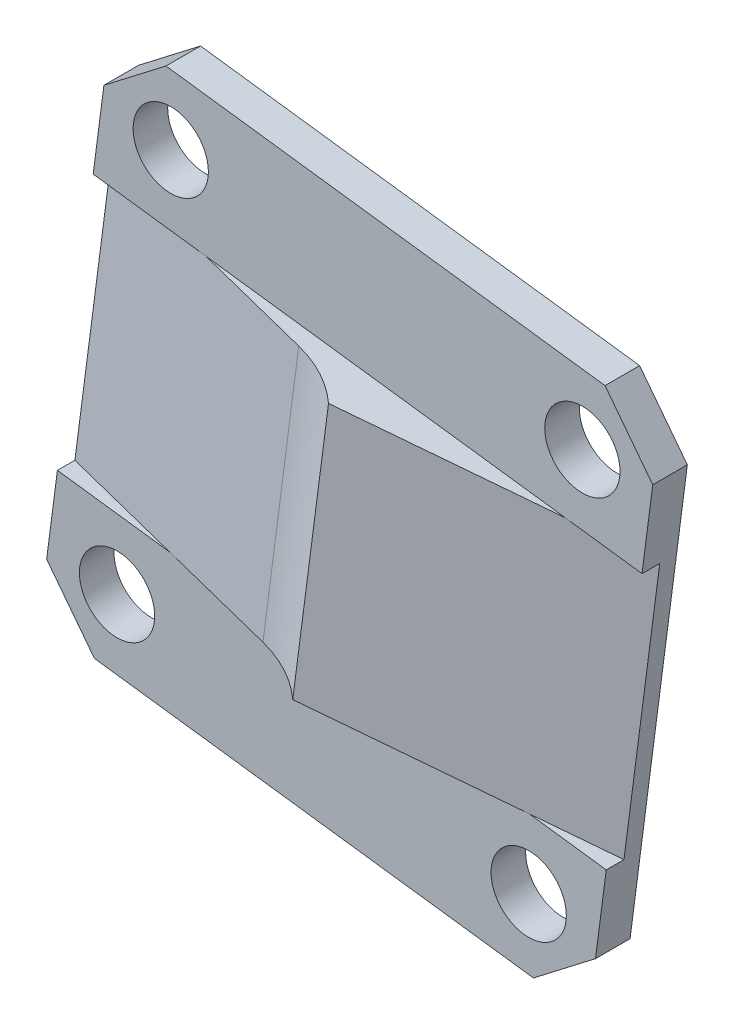
ISO-10303-21;
HEADER;
FILE_DESCRIPTION(('STEP AP214'),'2;1');
FILE_NAME('part.step','',(''),(''),'','','');
FILE_SCHEMA(('AUTOMOTIVE_DESIGN { 1 0 10303 214 1 1 1 1 }'));
ENDSEC;
DATA;
#1=APPLICATION_CONTEXT('core data for automotive mechanical design processes');
#2=APPLICATION_PROTOCOL_DEFINITION('international standard','automotive_design',2000,#1);
#3=PRODUCT_CONTEXT('',#1,'mechanical');
#4=PRODUCT('Part','Part','',(#3));
#5=PRODUCT_RELATED_PRODUCT_CATEGORY('part','',(#4));
#6=PRODUCT_DEFINITION_FORMATION('','',#4);
#7=PRODUCT_DEFINITION_CONTEXT('part definition',#1,'design');
#8=PRODUCT_DEFINITION('design','',#6,#7);
#9=PRODUCT_DEFINITION_SHAPE('','',#8);
#10=(LENGTH_UNIT() NAMED_UNIT(*) SI_UNIT(.MILLI.,.METRE.));
#11=(NAMED_UNIT(*) PLANE_ANGLE_UNIT() SI_UNIT($,.RADIAN.));
#12=(NAMED_UNIT(*) SI_UNIT($,.STERADIAN.) SOLID_ANGLE_UNIT());
#13=UNCERTAINTY_MEASURE_WITH_UNIT(LENGTH_MEASURE(1.E-05),#10,'distance_accuracy_value','');
#14=(GEOMETRIC_REPRESENTATION_CONTEXT(3) GLOBAL_UNCERTAINTY_ASSIGNED_CONTEXT((#13)) GLOBAL_UNIT_ASSIGNED_CONTEXT((#10,
#11,#12)) REPRESENTATION_CONTEXT('',''));
#15=CARTESIAN_POINT('',(0.,0.,0.));
#16=DIRECTION('',(0.,0.,1.));
#17=DIRECTION('',(1.,0.,0.));
#18=AXIS2_PLACEMENT_3D('',#15,#16,#17);
#19=CARTESIAN_POINT('',(-12.8749201201289,-95.3131633302013,-16.3901470670248));
#20=DIRECTION('',(0.129314816705219,0.991603589233367,0.));
#21=DIRECTION('',(-0.991603589233367,0.129314816705219,0.));
#22=AXIS2_PLACEMENT_3D('',#19,#20,#21);
#23=PLANE('',#22);
#24=CARTESIAN_POINT('',(-25.4682857033926,-93.670865158045,7.42404495764267));
#25=DIRECTION('',(0.129314816705216,0.991603589233367,0.));
#26=DIRECTION('',(-0.991603589233367,0.129314816705216,0.));
#27=AXIS2_PLACEMENT_3D('',#24,#25,#26);
#28=CIRCLE('',#27,5.11292162566616);
#29=CARTESIAN_POINT('',(-22.0751697641245,-94.1133606981078,3.62497540446073));
#30=VERTEX_POINT('',#29);
#31=CARTESIAN_POINT('',(-24.6967930672789,-93.7714753513841,2.37066546945623));
#32=VERTEX_POINT('',#31);
#33=EDGE_CURVE('E324',#30,#32,#28,.T.);
#34=ORIENTED_EDGE('',*,*,#33,.F.);
#35=DIRECTION('',(-0.966583129481826,0.126051903781364,0.223221798564149));
#36=VECTOR('',#35,1.);
#37=CARTESIAN_POINT('',(-22.4956389147935,-94.0585274040986,3.72207815454017));
#38=LINE('',#37,#36);
#39=CARTESIAN_POINT('',(-13.2526024102469,-95.2639098617289,1.5875));
#40=VERTEX_POINT('',#39);
#41=EDGE_CURVE('E319',#40,#30,#38,.T.);
#42=ORIENTED_EDGE('',*,*,#41,.F.);
#43=DIRECTION('',(0.991603589233367,-0.129314816705219,0.));
#44=VECTOR('',#43,1.);
#45=CARTESIAN_POINT('',(-12.8749201201289,-95.3131633302013,1.5875));
#46=LINE('',#45,#44);
#47=CARTESIAN_POINT('',(-29.7408483644544,-93.1136811549053,1.5875));
#48=VERTEX_POINT('',#47);
#49=EDGE_CURVE('E163',#48,#40,#46,.T.);
#50=ORIENTED_EDGE('',*,*,#49,.F.);
#51=DIRECTION('',(-0.980055945526266,0.127808890904245,-0.152168429854696));
#52=VECTOR('',#51,1.);
#53=CARTESIAN_POINT('',(-34.7935403491285,-92.454760649816,0.802993554876186));
#54=LINE('',#53,#52);
#55=EDGE_CURVE('E325',#32,#48,#54,.T.);
#56=ORIENTED_EDGE('',*,*,#55,.F.);
#57=EDGE_LOOP('',(#34,#42,#50,#56));
#58=FACE_BOUND('',#57,.T.);
#59=ADVANCED_FACE('F40',(#58),#23,.T.);
#60=CARTESIAN_POINT('',(-33.4072666671808,-105.443081655231,-16.3901470670248));
#61=DIRECTION('',(-0.129314816705217,-0.991603589233367,0.));
#62=DIRECTION('',(0.991603589233367,-0.129314816705217,0.));
#63=AXIS2_PLACEMENT_3D('',#60,#61,#62);
#64=PLANE('',#63);
#65=DIRECTION('',(-0.991603589233367,0.129314816705215,0.));
#66=VECTOR('',#65,1.);
#67=CARTESIAN_POINT('',(-14.5172182922851,-107.906528913465,1.5875));
#68=LINE('',#67,#66);
#69=CARTESIAN_POINT('',(-14.8949005824032,-107.857275444993,1.5875));
#70=VERTEX_POINT('',#69);
#71=CARTESIAN_POINT('',(-31.3831465366103,-105.707046738169,1.58750000000002));
#72=VERTEX_POINT('',#71);
#73=EDGE_CURVE('E295',#70,#72,#68,.T.);
#74=ORIENTED_EDGE('',*,*,#73,.F.);
#75=DIRECTION('',(0.966583129481826,-0.12605190378136,-0.22322179856415));
#76=VECTOR('',#75,1.);
#77=CARTESIAN_POINT('',(-24.13793708695,-106.651892987362,3.72207815454021));
#78=LINE('',#77,#76);
#79=CARTESIAN_POINT('',(-23.7174679362808,-106.706726281372,3.62497540446073));
#80=VERTEX_POINT('',#79);
#81=EDGE_CURVE('E313',#80,#70,#78,.T.);
#82=ORIENTED_EDGE('',*,*,#81,.F.);
#83=CARTESIAN_POINT('',(-27.1105838755489,-106.264230741309,7.42404495764267));
#84=DIRECTION('',(0.129314816705216,0.991603589233367,0.));
#85=DIRECTION('',(-0.991603589233367,0.129314816705216,0.));
#86=AXIS2_PLACEMENT_3D('',#83,#84,#85);
#87=CIRCLE('',#86,5.11292162566616);
#88=CARTESIAN_POINT('',(-26.3390912394352,-106.364840934648,2.37066546945623));
#89=VERTEX_POINT('',#88);
#90=EDGE_CURVE('E301',#89,#80,#87,.F.);
#91=ORIENTED_EDGE('',*,*,#90,.F.);
#92=DIRECTION('',(-0.980055945526266,0.127808890904247,-0.152168429854696));
#93=VECTOR('',#92,1.);
#94=CARTESIAN_POINT('',(-36.0414684643116,-105.099555949738,0.86422543926528));
#95=LINE('',#94,#93);
#96=EDGE_CURVE('E270',#89,#72,#95,.T.);
#97=ORIENTED_EDGE('',*,*,#96,.T.);
#98=EDGE_LOOP('',(#74,#82,#91,#97));
#99=FACE_BOUND('',#98,.T.);
#100=ADVANCED_FACE('F299',(#99),#64,.T.);
#101=CARTESIAN_POINT('',(-37.3767571490748,-111.329189903824,1.5875));
#102=DIRECTION('',(0.129314816705217,0.991603589233367,0.));
#103=DIRECTION('',(-0.991603589233367,0.129314816705217,0.));
#104=AXIS2_PLACEMENT_3D('',#101,#102,#103);
#105=PLANE('',#104);
#106=DIRECTION('',(0.991603589233367,-0.129314816705217,0.));
#107=VECTOR('',#106,1.);
#108=CARTESIAN_POINT('',(-37.3767571490748,-111.329189903824,0.));
#109=LINE('',#108,#107);
#110=CARTESIAN_POINT('',(-34.8580840324221,-111.657649538255,0.));
#111=VERTEX_POINT('',#110);
#112=CARTESIAN_POINT('',(-14.7086990992001,-114.285326613705,0.));
#113=VERTEX_POINT('',#112);
#114=EDGE_CURVE('E214',#111,#113,#109,.T.);
#115=ORIENTED_EDGE('',*,*,#114,.T.);
#116=DIRECTION('',(0.,0.,1.));
#117=VECTOR('',#116,1.);
#118=CARTESIAN_POINT('',(-14.7086990992001,-114.285326613705,1.5875));
#119=LINE('',#118,#117);
#120=CARTESIAN_POINT('',(-14.7086990992001,-114.285326613705,1.5875));
#121=VERTEX_POINT('',#120);
#122=EDGE_CURVE('E256',#113,#121,#119,.T.);
#123=ORIENTED_EDGE('',*,*,#122,.T.);
#124=DIRECTION('',(0.991603589233367,-0.129314816705217,0.));
#125=VECTOR('',#124,1.);
#126=CARTESIAN_POINT('',(-37.3767571490748,-111.329189903824,1.5875));
#127=LINE('',#126,#125);
#128=CARTESIAN_POINT('',(-34.8580840324221,-111.657649538255,1.5875));
#129=VERTEX_POINT('',#128);
#130=EDGE_CURVE('E199',#129,#121,#127,.T.);
#131=ORIENTED_EDGE('',*,*,#130,.F.);
#132=DIRECTION('',(0.,0.,-1.));
#133=VECTOR('',#132,1.);
#134=CARTESIAN_POINT('',(-34.8580840324221,-111.657649538255,1.5875));
#135=LINE('',#134,#133);
#136=EDGE_CURVE('E253',#129,#111,#135,.T.);
#137=ORIENTED_EDGE('',*,*,#136,.T.);
#138=EDGE_LOOP('',(#115,#123,#131,#137));
#139=FACE_BOUND('',#138,.T.);
#140=ADVANCED_FACE('F342',(#139),#105,.F.);
#141=CARTESIAN_POINT('',(-34.0921608047624,-86.142458737296,1.5875));
#142=DIRECTION('',(-0.129314816705216,-0.991603589233367,0.));
#143=DIRECTION('',(0.991603589233367,-0.129314816705216,0.));
#144=AXIS2_PLACEMENT_3D('',#141,#142,#143);
#145=PLANE('',#144);
#146=DIRECTION('',(-0.991603589233367,0.129314816705216,0.));
#147=VECTOR('',#146,1.);
#148=CARTESIAN_POINT('',(-34.0921608047624,-86.142458737296,1.5875));
#149=LINE('',#148,#147);
#150=CARTESIAN_POINT('',(-11.4241027548876,-89.0985954471772,1.5875));
#151=VERTEX_POINT('',#150);
#152=CARTESIAN_POINT('',(-31.5734876881096,-86.4709183717272,1.5875));
#153=VERTEX_POINT('',#152);
#154=EDGE_CURVE('E186',#151,#153,#149,.T.);
#155=ORIENTED_EDGE('',*,*,#154,.F.);
#156=DIRECTION('',(0.,0.,-1.));
#157=VECTOR('',#156,1.);
#158=CARTESIAN_POINT('',(-11.4241027548876,-89.0985954471772,1.5875));
#159=LINE('',#158,#157);
#160=CARTESIAN_POINT('',(-11.4241027548876,-89.0985954471772,0.));
#161=VERTEX_POINT('',#160);
#162=EDGE_CURVE('E236',#151,#161,#159,.T.);
#163=ORIENTED_EDGE('',*,*,#162,.T.);
#164=DIRECTION('',(-0.991603589233367,0.129314816705216,0.));
#165=VECTOR('',#164,1.);
#166=CARTESIAN_POINT('',(-34.0921608047624,-86.142458737296,0.));
#167=LINE('',#166,#165);
#168=CARTESIAN_POINT('',(-31.5734876881096,-86.4709183717272,0.));
#169=VERTEX_POINT('',#168);
#170=EDGE_CURVE('E226',#161,#169,#167,.T.);
#171=ORIENTED_EDGE('',*,*,#170,.T.);
#172=DIRECTION('',(0.,0.,1.));
#173=VECTOR('',#172,1.);
#174=CARTESIAN_POINT('',(-31.5734876881096,-86.4709183717272,1.5875));
#175=LINE('',#174,#173);
#176=EDGE_CURVE('E221',#169,#153,#175,.T.);
#177=ORIENTED_EDGE('',*,*,#176,.T.);
#178=EDGE_LOOP('',(#155,#163,#171,#177));
#179=FACE_BOUND('',#178,.T.);
#180=ADVANCED_FACE('F353',(#179),#145,.F.);
#181=CARTESIAN_POINT('',(-14.9277928353242,-111.054870309281,0.));
#182=DIRECTION('',(0.,0.,-1.));
#183=DIRECTION('',(-1.,0.,0.));
#184=AXIS2_PLACEMENT_3D('',#181,#182,#183);
#185=CYLINDRICAL_SURFACE('',#184,1.72719999999999);
#186=CARTESIAN_POINT('',(-14.9277928353242,-111.054870309281,0.));
#187=DIRECTION('',(0.,0.,-1.));
#188=DIRECTION('',(-1.,0.,0.));
#189=AXIS2_PLACEMENT_3D('',#186,#187,#188);
#190=CIRCLE('',#189,1.72719999999999);
#191=CARTESIAN_POINT('',(-16.6549928353242,-111.054870309281,0.));
#192=VERTEX_POINT('',#191);
#193=EDGE_CURVE('E211',#192,#192,#190,.T.);
#194=ORIENTED_EDGE('',*,*,#193,.T.);
#195=EDGE_LOOP('',(#194));
#196=FACE_BOUND('',#195,.T.);
#197=CARTESIAN_POINT('',(-14.9277928353242,-111.054870309281,1.5875));
#198=DIRECTION('',(0.,0.,1.));
#199=DIRECTION('',(1.,0.,0.));
#200=AXIS2_PLACEMENT_3D('',#197,#198,#199);
#201=CIRCLE('',#200,1.72719999999999);
#202=CARTESIAN_POINT('',(-13.2005928353242,-111.054870309281,1.5875));
#203=VERTEX_POINT('',#202);
#204=EDGE_CURVE('E198',#203,#203,#201,.F.);
#205=ORIENTED_EDGE('',*,*,#204,.F.);
#206=EDGE_LOOP('',(#205));
#207=FACE_BOUND('',#206,.T.);
#208=ADVANCED_FACE('F355',(#196,#207),#185,.F.);
#209=CARTESIAN_POINT('',(-33.8178412102199,-108.591423051047,0.));
#210=DIRECTION('',(0.,0.,-1.));
#211=DIRECTION('',(-1.,0.,0.));
#212=AXIS2_PLACEMENT_3D('',#209,#210,#211);
#213=CYLINDRICAL_SURFACE('',#212,1.72719999999999);
#214=CARTESIAN_POINT('',(-33.8178412102199,-108.591423051047,0.));
#215=DIRECTION('',(0.,0.,-1.));
#216=DIRECTION('',(-1.,0.,0.));
#217=AXIS2_PLACEMENT_3D('',#214,#215,#216);
#218=CIRCLE('',#217,1.72719999999998);
#219=CARTESIAN_POINT('',(-35.5450412102198,-108.591423051047,0.));
#220=VERTEX_POINT('',#219);
#221=EDGE_CURVE('E208',#220,#220,#218,.T.);
#222=ORIENTED_EDGE('',*,*,#221,.T.);
#223=EDGE_LOOP('',(#222));
#224=FACE_BOUND('',#223,.T.);
#225=CARTESIAN_POINT('',(-33.8178412102199,-108.591423051047,1.5875));
#226=DIRECTION('',(0.,0.,1.));
#227=DIRECTION('',(1.,0.,0.));
#228=AXIS2_PLACEMENT_3D('',#225,#226,#227);
#229=CIRCLE('',#228,1.72719999999999);
#230=CARTESIAN_POINT('',(-32.0906412102199,-108.591423051047,1.5875));
#231=VERTEX_POINT('',#230);
#232=EDGE_CURVE('E194',#231,#231,#229,.F.);
#233=ORIENTED_EDGE('',*,*,#232,.F.);
#234=EDGE_LOOP('',(#233));
#235=FACE_BOUND('',#234,.T.);
#236=ADVANCED_FACE('F361',(#224,#235),#213,.F.);
#237=CARTESIAN_POINT('',(-31.3543939519855,-89.701374676151,0.));
#238=DIRECTION('',(0.,0.,-1.));
#239=DIRECTION('',(-1.,0.,0.));
#240=AXIS2_PLACEMENT_3D('',#237,#238,#239);
#241=CYLINDRICAL_SURFACE('',#240,1.72719999999999);
#242=CARTESIAN_POINT('',(-31.3543939519855,-89.701374676151,0.));
#243=DIRECTION('',(0.,0.,-1.));
#244=DIRECTION('',(-1.,0.,0.));
#245=AXIS2_PLACEMENT_3D('',#242,#243,#244);
#246=CIRCLE('',#245,1.72719999999999);
#247=CARTESIAN_POINT('',(-33.0815939519855,-89.701374676151,0.));
#248=VERTEX_POINT('',#247);
#249=EDGE_CURVE('E205',#248,#248,#246,.T.);
#250=ORIENTED_EDGE('',*,*,#249,.T.);
#251=EDGE_LOOP('',(#250));
#252=FACE_BOUND('',#251,.T.);
#253=CARTESIAN_POINT('',(-31.3543939519855,-89.701374676151,1.5875));
#254=DIRECTION('',(0.,0.,1.));
#255=DIRECTION('',(1.,0.,0.));
#256=AXIS2_PLACEMENT_3D('',#253,#254,#255);
#257=CIRCLE('',#256,1.72719999999999);
#258=CARTESIAN_POINT('',(-29.6271939519855,-89.701374676151,1.5875));
#259=VERTEX_POINT('',#258);
#260=EDGE_CURVE('E182',#259,#259,#257,.F.);
#261=ORIENTED_EDGE('',*,*,#260,.F.);
#262=EDGE_LOOP('',(#261));
#263=FACE_BOUND('',#262,.T.);
#264=ADVANCED_FACE('F383',(#252,#263),#241,.F.);
#265=CARTESIAN_POINT('',(-12.4643455770898,-92.1648219343853,0.));
#266=DIRECTION('',(0.,0.,-1.));
#267=DIRECTION('',(-1.,0.,0.));
#268=AXIS2_PLACEMENT_3D('',#265,#266,#267);
#269=CYLINDRICAL_SURFACE('',#268,1.72719999999999);
#270=CARTESIAN_POINT('',(-12.4643455770898,-92.1648219343853,0.));
#271=DIRECTION('',(0.,0.,-1.));
#272=DIRECTION('',(-1.,0.,0.));
#273=AXIS2_PLACEMENT_3D('',#270,#271,#272);
#274=CIRCLE('',#273,1.72719999999999);
#275=CARTESIAN_POINT('',(-14.1915455770898,-92.1648219343853,0.));
#276=VERTEX_POINT('',#275);
#277=EDGE_CURVE('E202',#276,#276,#274,.T.);
#278=ORIENTED_EDGE('',*,*,#277,.T.);
#279=EDGE_LOOP('',(#278));
#280=FACE_BOUND('',#279,.T.);
#281=CARTESIAN_POINT('',(-12.4643455770898,-92.1648219343853,1.5875));
#282=DIRECTION('',(0.,0.,1.));
#283=DIRECTION('',(1.,0.,0.));
#284=AXIS2_PLACEMENT_3D('',#281,#282,#283);
#285=CIRCLE('',#284,1.72719999999999);
#286=CARTESIAN_POINT('',(-10.7371455770898,-92.1648219343853,1.5875));
#287=VERTEX_POINT('',#286);
#288=EDGE_CURVE('E183',#287,#287,#285,.F.);
#289=ORIENTED_EDGE('',*,*,#288,.F.);
#290=EDGE_LOOP('',(#289));
#291=FACE_BOUND('',#290,.T.);
#292=ADVANCED_FACE('F380',(#280,#291),#269,.F.);
#293=CARTESIAN_POINT('',(-12.1900259825473,-114.613786248136,1.5875));
#294=DIRECTION('',(-0.991603589233367,0.129314816705216,0.));
#295=DIRECTION('',(-0.129314816705216,-0.991603589233367,0.));
#296=AXIS2_PLACEMENT_3D('',#293,#294,#295);
#297=PLANE('',#296);
#298=DIRECTION('',(-0.129314816705216,-0.991603589233367,0.));
#299=VECTOR('',#298,1.);
#300=CARTESIAN_POINT('',(-12.1900259825473,-114.613786248136,0.773203407242427));
#301=LINE('',#300,#299);
#302=CARTESIAN_POINT('',(-9.72657872431296,-95.7237378732403,0.773203407242454));
#303=VERTEX_POINT('',#302);
#304=CARTESIAN_POINT('',(-11.3688768964692,-108.317103456504,0.773203407242436));
#305=VERTEX_POINT('',#304);
#306=EDGE_CURVE('E287',#303,#305,#301,.T.);
#307=ORIENTED_EDGE('',*,*,#306,.T.);
#308=DIRECTION('',(0.,1.43045566281054E-13,1.));
#309=VECTOR('',#308,1.);
#310=CARTESIAN_POINT('',(-11.3688768964692,-108.317103456504,1.58749999999908));
#311=LINE('',#310,#309);
#312=CARTESIAN_POINT('',(-11.3688768964691,-108.317103456504,1.5875));
#313=VERTEX_POINT('',#312);
#314=EDGE_CURVE('E176',#305,#313,#311,.T.);
#315=ORIENTED_EDGE('',*,*,#314,.T.);
#316=DIRECTION('',(0.129314816705216,0.991603589233367,0.));
#317=VECTOR('',#316,1.);
#318=CARTESIAN_POINT('',(-12.1900259825473,-114.613786248136,1.5875));
#319=LINE('',#318,#317);
#320=CARTESIAN_POINT('',(-11.8615663481161,-112.095113131483,1.5875));
#321=VERTEX_POINT('',#320);
#322=EDGE_CURVE('E215',#321,#313,#319,.T.);
#323=ORIENTED_EDGE('',*,*,#322,.F.);
#324=DIRECTION('',(0.,0.,-1.));
#325=VECTOR('',#324,1.);
#326=CARTESIAN_POINT('',(-11.8615663481161,-112.095113131483,1.5875));
#327=LINE('',#326,#325);
#328=CARTESIAN_POINT('',(-11.8615663481161,-112.095113131483,0.));
#329=VERTEX_POINT('',#328);
#330=EDGE_CURVE('E247',#321,#329,#327,.T.);
#331=ORIENTED_EDGE('',*,*,#330,.T.);
#332=DIRECTION('',(0.129314816705216,0.991603589233367,0.));
#333=VECTOR('',#332,1.);
#334=CARTESIAN_POINT('',(-12.1900259825473,-114.613786248136,0.));
#335=LINE('',#334,#333);
#336=CARTESIAN_POINT('',(-9.23388927266609,-91.9457281982612,0.));
#337=VERTEX_POINT('',#336);
#338=EDGE_CURVE('E224',#329,#337,#335,.T.);
#339=ORIENTED_EDGE('',*,*,#338,.T.);
#340=DIRECTION('',(0.,0.,1.));
#341=VECTOR('',#340,1.);
#342=CARTESIAN_POINT('',(-9.23388927266609,-91.9457281982612,1.5875));
#343=LINE('',#342,#341);
#344=CARTESIAN_POINT('',(-9.23388927266603,-91.9457281982612,1.5875));
#345=VERTEX_POINT('',#344);
#346=EDGE_CURVE('E181',#337,#345,#343,.T.);
#347=ORIENTED_EDGE('',*,*,#346,.T.);
#348=DIRECTION('',(-0.129314816705216,-0.991603589233367,0.));
#349=VECTOR('',#348,1.);
#350=CARTESIAN_POINT('',(-15.4960831563037,-139.965081971508,1.5875));
#351=LINE('',#350,#349);
#352=CARTESIAN_POINT('',(-9.7265787243129,-95.7237378732403,1.5875));
#353=VERTEX_POINT('',#352);
#354=EDGE_CURVE('E159',#345,#353,#351,.T.);
#355=ORIENTED_EDGE('',*,*,#354,.T.);
#356=DIRECTION('',(0.,0.,-1.));
#357=VECTOR('',#356,1.);
#358=CARTESIAN_POINT('',(-9.72657872431296,-95.7237378732403,1.58750000000025));
#359=LINE('',#358,#357);
#360=EDGE_CURVE('E170',#353,#303,#359,.T.);
#361=ORIENTED_EDGE('',*,*,#360,.T.);
#362=EDGE_LOOP('',(#307,#315,#323,#331,#339,#347,#355,#361));
#363=FACE_BOUND('',#362,.T.);
#364=ADVANCED_FACE('F178',(#363),#297,.F.);
#365=CARTESIAN_POINT('',(-37.3767571490748,-111.329189903824,1.5875));
#366=DIRECTION('',(0.991603589233367,-0.129314816705216,0.));
#367=DIRECTION('',(0.129314816705216,0.991603589233367,0.));
#368=AXIS2_PLACEMENT_3D('',#365,#366,#367);
#369=PLANE('',#368);
#370=DIRECTION('',(-0.129314816705216,-0.991603589233367,0.));
#371=VECTOR('',#370,1.);
#372=CARTESIAN_POINT('',(-37.3767571490748,-111.329189903824,0.));
#373=LINE('',#372,#371);
#374=CARTESIAN_POINT('',(-34.4206204391936,-88.6611318539487,0.));
#375=VERTEX_POINT('',#374);
#376=CARTESIAN_POINT('',(-37.0482975146436,-108.810516787171,0.));
#377=VERTEX_POINT('',#376);
#378=EDGE_CURVE('E219',#375,#377,#373,.T.);
#379=ORIENTED_EDGE('',*,*,#378,.T.);
#380=DIRECTION('',(0.,0.,1.));
#381=VECTOR('',#380,1.);
#382=CARTESIAN_POINT('',(-37.0482975146436,-108.810516787171,1.5875));
#383=LINE('',#382,#381);
#384=CARTESIAN_POINT('',(-37.0482975146436,-108.810516787171,1.5875));
#385=VERTEX_POINT('',#384);
#386=EDGE_CURVE('E263',#377,#385,#383,.T.);
#387=ORIENTED_EDGE('',*,*,#386,.T.);
#388=DIRECTION('',(0.129314816705216,0.991603589233367,0.));
#389=VECTOR('',#388,1.);
#390=CARTESIAN_POINT('',(-40.6828143228312,-136.680485627195,1.5875));
#391=LINE('',#390,#389);
#392=CARTESIAN_POINT('',(-36.5556080629967,-105.032507112192,1.5875));
#393=VERTEX_POINT('',#392);
#394=EDGE_CURVE('E195',#385,#393,#391,.T.);
#395=ORIENTED_EDGE('',*,*,#394,.T.);
#396=DIRECTION('',(0.,0.,-1.));
#397=VECTOR('',#396,1.);
#398=CARTESIAN_POINT('',(-36.5556080629967,-105.032507112192,6.23249877893638));
#399=LINE('',#398,#397);
#400=CARTESIAN_POINT('',(-36.5556080629967,-105.032507112192,0.784397531669635));
#401=VERTEX_POINT('',#400);
#402=EDGE_CURVE('E273',#393,#401,#399,.T.);
#403=ORIENTED_EDGE('',*,*,#402,.T.);
#404=DIRECTION('',(0.129314816705216,0.991603589233367,0.));
#405=VECTOR('',#404,1.);
#406=CARTESIAN_POINT('',(-40.6828143228312,-136.680485627195,0.78439753166964));
#407=LINE('',#406,#405);
#408=CARTESIAN_POINT('',(-34.9133098908405,-92.4391415289277,0.784397531669635));
#409=VERTEX_POINT('',#408);
#410=EDGE_CURVE('E12',#401,#409,#407,.T.);
#411=ORIENTED_EDGE('',*,*,#410,.T.);
#412=DIRECTION('',(0.,0.,-1.));
#413=VECTOR('',#412,1.);
#414=CARTESIAN_POINT('',(-34.9133098908405,-92.4391415289277,1.58750000000001));
#415=LINE('',#414,#413);
#416=CARTESIAN_POINT('',(-34.9133098908405,-92.4391415289278,1.5875));
#417=VERTEX_POINT('',#416);
#418=EDGE_CURVE('E48',#417,#409,#415,.T.);
#419=ORIENTED_EDGE('',*,*,#418,.F.);
#420=DIRECTION('',(-0.129314816705216,-0.991603589233367,0.));
#421=VECTOR('',#420,1.);
#422=CARTESIAN_POINT('',(-37.3767571490748,-111.329189903824,1.5875));
#423=LINE('',#422,#421);
#424=CARTESIAN_POINT('',(-34.4206204391936,-88.6611318539487,1.5875));
#425=VERTEX_POINT('',#424);
#426=EDGE_CURVE('E218',#425,#417,#423,.T.);
#427=ORIENTED_EDGE('',*,*,#426,.F.);
#428=DIRECTION('',(0.,0.,-1.));
#429=VECTOR('',#428,1.);
#430=CARTESIAN_POINT('',(-34.4206204391936,-88.6611318539487,1.5875));
#431=LINE('',#430,#429);
#432=EDGE_CURVE('E260',#425,#375,#431,.T.);
#433=ORIENTED_EDGE('',*,*,#432,.T.);
#434=EDGE_LOOP('',(#379,#387,#395,#403,#411,#419,#427,#433));
#435=FACE_BOUND('',#434,.T.);
#436=ADVANCED_FACE('F281',(#435),#369,.F.);
#437=CARTESIAN_POINT('',(0.,0.,0.));
#438=DIRECTION('',(0.,0.,1.));
#439=DIRECTION('',(1.,0.,0.));
#440=AXIS2_PLACEMENT_3D('',#437,#438,#439);
#441=PLANE('',#440);
#442=ORIENTED_EDGE('',*,*,#277,.F.);
#443=EDGE_LOOP('',(#442));
#444=FACE_BOUND('',#443,.T.);
#445=ORIENTED_EDGE('',*,*,#249,.F.);
#446=EDGE_LOOP('',(#445));
#447=FACE_BOUND('',#446,.T.);
#448=ORIENTED_EDGE('',*,*,#221,.F.);
#449=EDGE_LOOP('',(#448));
#450=FACE_BOUND('',#449,.T.);
#451=ORIENTED_EDGE('',*,*,#193,.F.);
#452=EDGE_LOOP('',(#451));
#453=FACE_BOUND('',#452,.T.);
#454=ORIENTED_EDGE('',*,*,#170,.F.);
#455=DIRECTION('',(-0.609730238395681,0.792609005995987,0.));
#456=VECTOR('',#455,1.);
#457=CARTESIAN_POINT('',(-11.4241027548876,-89.0985954471772,0.));
#458=LINE('',#457,#456);
#459=EDGE_CURVE('E245',#161,#337,#458,.F.);
#460=ORIENTED_EDGE('',*,*,#459,.T.);
#461=ORIENTED_EDGE('',*,*,#338,.F.);
#462=DIRECTION('',(0.792609005995989,0.609730238395679,0.));
#463=VECTOR('',#462,1.);
#464=CARTESIAN_POINT('',(-11.8615663481161,-112.095113131483,0.));
#465=LINE('',#464,#463);
#466=EDGE_CURVE('E243',#329,#113,#465,.F.);
#467=ORIENTED_EDGE('',*,*,#466,.T.);
#468=ORIENTED_EDGE('',*,*,#114,.F.);
#469=DIRECTION('',(0.60973023839568,-0.792609005995987,0.));
#470=VECTOR('',#469,1.);
#471=CARTESIAN_POINT('',(-34.8580840324221,-111.657649538255,0.));
#472=LINE('',#471,#470);
#473=EDGE_CURVE('E241',#111,#377,#472,.F.);
#474=ORIENTED_EDGE('',*,*,#473,.T.);
#475=ORIENTED_EDGE('',*,*,#378,.F.);
#476=DIRECTION('',(-0.79260900599599,-0.609730238395677,0.));
#477=VECTOR('',#476,1.);
#478=CARTESIAN_POINT('',(-34.4206204391936,-88.6611318539487,0.));
#479=LINE('',#478,#477);
#480=EDGE_CURVE('E239',#375,#169,#479,.F.);
#481=ORIENTED_EDGE('',*,*,#480,.T.);
#482=EDGE_LOOP('',(#454,#460,#461,#467,#468,#474,#475,#481));
#483=FACE_BOUND('',#482,.T.);
#484=ADVANCED_FACE('F335',(#444,#447,#450,#453,#483),#441,.F.);
#485=CARTESIAN_POINT('',(0.,0.,1.5875));
#486=DIRECTION('',(0.,0.,1.));
#487=DIRECTION('',(1.,0.,0.));
#488=AXIS2_PLACEMENT_3D('',#485,#486,#487);
#489=PLANE('',#488);
#490=ORIENTED_EDGE('',*,*,#426,.T.);
#491=EDGE_CURVE('E168',#417,#48,#46,.T.);
#492=ORIENTED_EDGE('',*,*,#491,.T.);
#493=ORIENTED_EDGE('',*,*,#49,.T.);
#494=EDGE_CURVE('E152',#40,#353,#46,.T.);
#495=ORIENTED_EDGE('',*,*,#494,.T.);
#496=ORIENTED_EDGE('',*,*,#354,.F.);
#497=DIRECTION('',(0.609730238395681,-0.792609005995987,0.));
#498=VECTOR('',#497,1.);
#499=CARTESIAN_POINT('',(-50.2363154021322,-38.6452845407333,1.5875));
#500=LINE('',#499,#498);
#501=EDGE_CURVE('E251',#345,#151,#500,.F.);
#502=ORIENTED_EDGE('',*,*,#501,.T.);
#503=ORIENTED_EDGE('',*,*,#154,.T.);
#504=DIRECTION('',(0.79260900599599,0.609730238395677,0.));
#505=VECTOR('',#504,1.);
#506=CARTESIAN_POINT('',(30.0513587183587,-39.0647799021084,1.5875));
#507=LINE('',#506,#505);
#508=EDGE_CURVE('E268',#153,#425,#507,.F.);
#509=ORIENTED_EDGE('',*,*,#508,.T.);
#510=EDGE_LOOP('',(#490,#492,#493,#495,#496,#502,#503,#509));
#511=FACE_BOUND('',#510,.T.);
#512=ORIENTED_EDGE('',*,*,#288,.T.);
#513=EDGE_LOOP('',(#512));
#514=FACE_BOUND('',#513,.T.);
#515=ORIENTED_EDGE('',*,*,#260,.T.);
#516=EDGE_LOOP('',(#515));
#517=FACE_BOUND('',#516,.T.);
#518=ADVANCED_FACE('F155',(#511,#514,#517),#489,.T.);
#519=CARTESIAN_POINT('',(0.,0.,1.5875));
#520=DIRECTION('',(0.,0.,1.));
#521=DIRECTION('',(1.,0.,0.));
#522=AXIS2_PLACEMENT_3D('',#519,#520,#521);
#523=PLANE('',#522);
#524=EDGE_CURVE('E166',#313,#70,#68,.T.);
#525=ORIENTED_EDGE('',*,*,#524,.T.);
#526=ORIENTED_EDGE('',*,*,#73,.T.);
#527=EDGE_CURVE('E290',#72,#393,#68,.T.);
#528=ORIENTED_EDGE('',*,*,#527,.T.);
#529=ORIENTED_EDGE('',*,*,#394,.F.);
#530=DIRECTION('',(-0.60973023839568,0.792609005995987,0.));
#531=VECTOR('',#530,1.);
#532=CARTESIAN_POINT('',(-75.8605101618882,-58.3572058807268,1.5875));
#533=LINE('',#532,#531);
#534=EDGE_CURVE('E265',#385,#129,#533,.F.);
#535=ORIENTED_EDGE('',*,*,#534,.T.);
#536=ORIENTED_EDGE('',*,*,#130,.T.);
#537=DIRECTION('',(-0.792609005995989,-0.609730238395679,0.));
#538=VECTOR('',#537,1.);
#539=CARTESIAN_POINT('',(49.7632800583521,-64.6889746618642,1.5875));
#540=LINE('',#539,#538);
#541=EDGE_CURVE('E258',#121,#321,#540,.F.);
#542=ORIENTED_EDGE('',*,*,#541,.T.);
#543=ORIENTED_EDGE('',*,*,#322,.T.);
#544=EDGE_LOOP('',(#525,#526,#528,#529,#535,#536,#542,#543));
#545=FACE_BOUND('',#544,.T.);
#546=ORIENTED_EDGE('',*,*,#232,.T.);
#547=EDGE_LOOP('',(#546));
#548=FACE_BOUND('',#547,.T.);
#549=ORIENTED_EDGE('',*,*,#204,.T.);
#550=EDGE_LOOP('',(#549));
#551=FACE_BOUND('',#550,.T.);
#552=ADVANCED_FACE('F302',(#545,#548,#551),#523,.T.);
#553=CARTESIAN_POINT('',(-11.4241027548876,-89.0985954471772,1.5875));
#554=DIRECTION('',(-0.792609005995987,-0.609730238395681,0.));
#555=DIRECTION('',(0.,0.,-1.));
#556=AXIS2_PLACEMENT_3D('',#553,#554,#555);
#557=PLANE('',#556);
#558=ORIENTED_EDGE('',*,*,#501,.F.);
#559=ORIENTED_EDGE('',*,*,#346,.F.);
#560=ORIENTED_EDGE('',*,*,#459,.F.);
#561=ORIENTED_EDGE('',*,*,#162,.F.);
#562=EDGE_LOOP('',(#558,#559,#560,#561));
#563=FACE_BOUND('',#562,.T.);
#564=ADVANCED_FACE('F351',(#563),#557,.F.);
#565=CARTESIAN_POINT('',(-11.8615663481161,-112.095113131483,1.5875));
#566=DIRECTION('',(-0.609730238395679,0.792609005995989,0.));
#567=DIRECTION('',(0.,0.,-1.));
#568=AXIS2_PLACEMENT_3D('',#565,#566,#567);
#569=PLANE('',#568);
#570=ORIENTED_EDGE('',*,*,#541,.F.);
#571=ORIENTED_EDGE('',*,*,#122,.F.);
#572=ORIENTED_EDGE('',*,*,#466,.F.);
#573=ORIENTED_EDGE('',*,*,#330,.F.);
#574=EDGE_LOOP('',(#570,#571,#572,#573));
#575=FACE_BOUND('',#574,.T.);
#576=ADVANCED_FACE('F347',(#575),#569,.F.);
#577=CARTESIAN_POINT('',(-34.8580840324221,-111.657649538255,1.5875));
#578=DIRECTION('',(0.792609005995987,0.60973023839568,0.));
#579=DIRECTION('',(0.,0.,-1.));
#580=AXIS2_PLACEMENT_3D('',#577,#578,#579);
#581=PLANE('',#580);
#582=ORIENTED_EDGE('',*,*,#534,.F.);
#583=ORIENTED_EDGE('',*,*,#386,.F.);
#584=ORIENTED_EDGE('',*,*,#473,.F.);
#585=ORIENTED_EDGE('',*,*,#136,.F.);
#586=EDGE_LOOP('',(#582,#583,#584,#585));
#587=FACE_BOUND('',#586,.T.);
#588=ADVANCED_FACE('F340',(#587),#581,.F.);
#589=CARTESIAN_POINT('',(-34.4206204391936,-88.6611318539487,1.5875));
#590=DIRECTION('',(0.609730238395676,-0.79260900599599,0.));
#591=DIRECTION('',(0.,0.,-1.));
#592=AXIS2_PLACEMENT_3D('',#589,#590,#591);
#593=PLANE('',#592);
#594=ORIENTED_EDGE('',*,*,#508,.F.);
#595=ORIENTED_EDGE('',*,*,#176,.F.);
#596=ORIENTED_EDGE('',*,*,#480,.F.);
#597=ORIENTED_EDGE('',*,*,#432,.F.);
#598=EDGE_LOOP('',(#594,#595,#596,#597));
#599=FACE_BOUND('',#598,.T.);
#600=ADVANCED_FACE('F42',(#599),#593,.F.);
#601=CARTESIAN_POINT('',(-22.8789014482718,-94.0085462172566,6.23249877893635));
#602=DIRECTION('',(-0.12931481670522,-0.991603589233367,0.));
#603=DIRECTION('',(0.991603589233367,-0.12931481670522,0.));
#604=AXIS2_PLACEMENT_3D('',#601,#602,#603);
#605=PLANE('',#604);
#606=ORIENTED_EDGE('',*,*,#418,.T.);
#607=EDGE_CURVE('E55',#48,#409,#54,.T.);
#608=ORIENTED_EDGE('',*,*,#607,.F.);
#609=ORIENTED_EDGE('',*,*,#491,.F.);
#610=EDGE_LOOP('',(#606,#608,#609));
#611=FACE_BOUND('',#610,.T.);
#612=ADVANCED_FACE('F278',(#611),#605,.T.);
#613=CARTESIAN_POINT('',(-24.5211996204282,-106.60191180052,6.23249877893638));
#614=DIRECTION('',(0.129314816705215,0.991603589233367,0.));
#615=DIRECTION('',(-0.991603589233367,0.129314816705215,0.));
#616=AXIS2_PLACEMENT_3D('',#613,#614,#615);
#617=PLANE('',#616);
#618=EDGE_CURVE('E309',#70,#305,#78,.T.);
#619=ORIENTED_EDGE('',*,*,#618,.F.);
#620=ORIENTED_EDGE('',*,*,#524,.F.);
#621=ORIENTED_EDGE('',*,*,#314,.F.);
#622=EDGE_LOOP('',(#619,#620,#621));
#623=FACE_BOUND('',#622,.T.);
#624=ADVANCED_FACE('F311',(#623),#617,.T.);
#625=DIRECTION('',(0.980055945526266,-0.127808890904247,0.152168429854696));
#626=VECTOR('',#625,1.);
#627=CARTESIAN_POINT('',(-36.4358385212847,-105.04812623308,0.802993554876199));
#628=LINE('',#627,#626);
#629=EDGE_CURVE('E62',#401,#72,#628,.T.);
#630=ORIENTED_EDGE('',*,*,#629,.F.);
#631=ORIENTED_EDGE('',*,*,#402,.F.);
#632=ORIENTED_EDGE('',*,*,#527,.F.);
#633=EDGE_LOOP('',(#630,#631,#632));
#634=FACE_BOUND('',#633,.T.);
#635=ADVANCED_FACE('F291',(#634),#617,.T.);
#636=EDGE_CURVE('E172',#303,#40,#38,.T.);
#637=ORIENTED_EDGE('',*,*,#636,.F.);
#638=ORIENTED_EDGE('',*,*,#360,.F.);
#639=ORIENTED_EDGE('',*,*,#494,.F.);
#640=EDGE_LOOP('',(#637,#638,#639));
#641=FACE_BOUND('',#640,.T.);
#642=ADVANCED_FACE('F171',(#641),#605,.T.);
#643=CARTESIAN_POINT('',(-28.2651433467844,-138.299871502366,3.7220781545402));
#644=DIRECTION('',(0.221347536651338,-0.0288658859659317,0.97476767931943));
#645=DIRECTION('',(0.975174040689062,0.,-0.221439812062256));
#646=AXIS2_PLACEMENT_3D('',#643,#644,#645);
#647=PLANE('',#646);
#648=DIRECTION('',(0.129314816705216,0.991603589233367,0.));
#649=VECTOR('',#648,1.);
#650=CARTESIAN_POINT('',(-27.8446741961153,-138.354704796375,3.62497540446073));
#651=LINE('',#650,#649);
#652=EDGE_CURVE('E314',#30,#80,#651,.F.);
#653=ORIENTED_EDGE('',*,*,#652,.T.);
#654=ORIENTED_EDGE('',*,*,#81,.T.);
#655=ORIENTED_EDGE('',*,*,#618,.T.);
#656=ORIENTED_EDGE('',*,*,#306,.F.);
#657=ORIENTED_EDGE('',*,*,#636,.T.);
#658=ORIENTED_EDGE('',*,*,#41,.T.);
#659=EDGE_LOOP('',(#653,#654,#655,#656,#657,#658));
#660=FACE_BOUND('',#659,.T.);
#661=ADVANCED_FACE('F317',(#660),#647,.T.);
#662=CARTESIAN_POINT('',(-31.2377901353834,-137.912209256313,7.42404495764267));
#663=DIRECTION('',(0.129314816705216,0.991603589233367,0.));
#664=DIRECTION('',(-0.991603589233367,0.129314816705216,0.));
#665=AXIS2_PLACEMENT_3D('',#662,#663,#664);
#666=CYLINDRICAL_SURFACE('',#665,5.11292162566616);
#667=DIRECTION('',(0.129314816705216,0.991603589233367,0.));
#668=VECTOR('',#667,1.);
#669=CARTESIAN_POINT('',(-30.4662974992697,-138.012819449652,2.37066546945623));
#670=LINE('',#669,#668);
#671=EDGE_CURVE('E286',#89,#32,#670,.T.);
#672=ORIENTED_EDGE('',*,*,#671,.F.);
#673=ORIENTED_EDGE('',*,*,#90,.T.);
#674=ORIENTED_EDGE('',*,*,#652,.F.);
#675=ORIENTED_EDGE('',*,*,#33,.T.);
#676=EDGE_LOOP('',(#672,#673,#674,#675));
#677=FACE_BOUND('',#676,.T.);
#678=ADVANCED_FACE('F420',(#677),#666,.F.);
#679=CARTESIAN_POINT('',(-40.5630447811192,-136.696104748084,0.802993554876196));
#680=DIRECTION('',(-0.150890761211922,0.0196776326149805,0.988354576533926));
#681=DIRECTION('',(0.988545982126194,0.,0.15091998284574));
#682=AXIS2_PLACEMENT_3D('',#679,#680,#681);
#683=PLANE('',#682);
#684=ORIENTED_EDGE('',*,*,#629,.T.);
#685=ORIENTED_EDGE('',*,*,#96,.F.);
#686=ORIENTED_EDGE('',*,*,#671,.T.);
#687=ORIENTED_EDGE('',*,*,#55,.T.);
#688=ORIENTED_EDGE('',*,*,#607,.T.);
#689=ORIENTED_EDGE('',*,*,#410,.F.);
#690=EDGE_LOOP('',(#684,#685,#686,#687,#688,#689));
#691=FACE_BOUND('',#690,.T.);
#692=ADVANCED_FACE('F283',(#691),#683,.T.);
#693=CLOSED_SHELL('',(#59,#100,#140,#180,#208,#236,#264,#292,#364,#436,#484,#518,#552,#564,#576,
#588,#600,#612,#624,#635,#642,#661,#678,#692));
#694=MANIFOLD_SOLID_BREP('B2',#693);
#695=ADVANCED_BREP_SHAPE_REPRESENTATION('',(#18,#694),#14);
#696=SHAPE_DEFINITION_REPRESENTATION(#9,#695);
ENDSEC;
END-ISO-10303-21;
